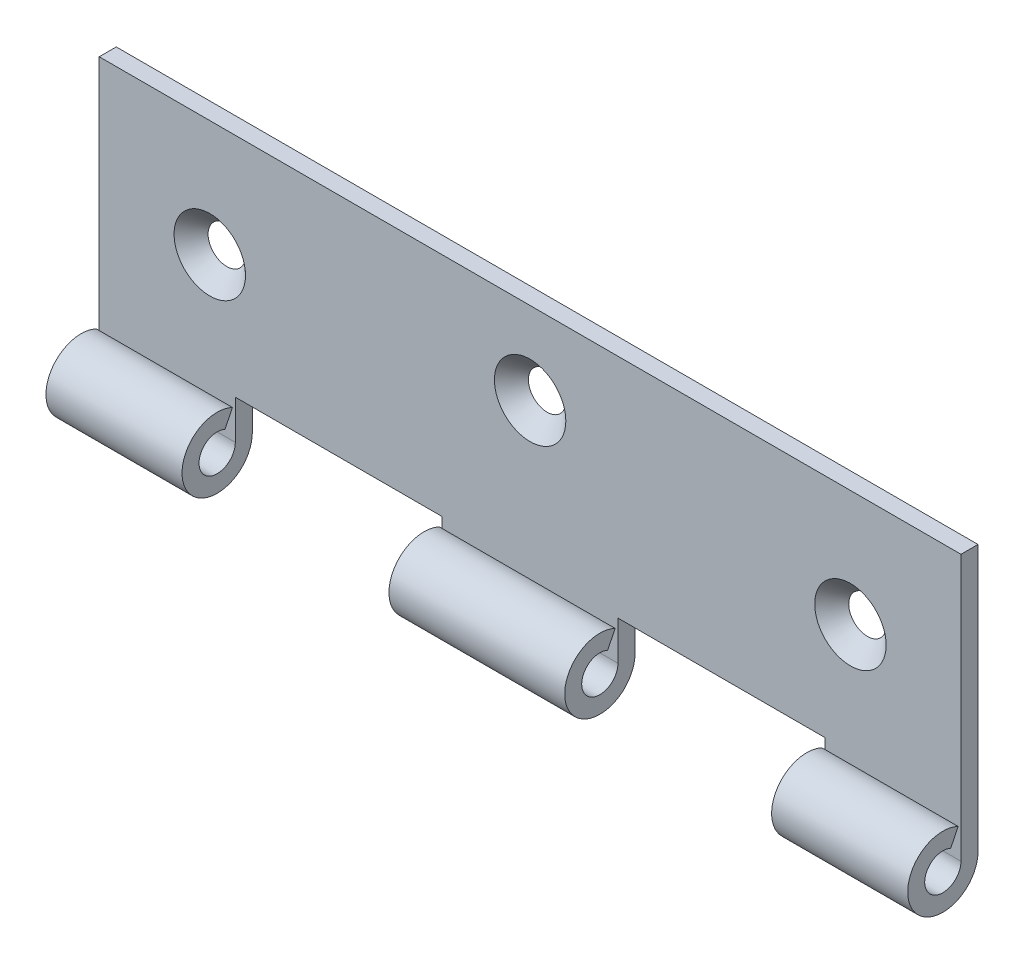
ISO-10303-21;
HEADER;
FILE_DESCRIPTION(('STEP AP214'),'2;1');
FILE_NAME('part.step','',(''),(''),'','','');
FILE_SCHEMA(('AUTOMOTIVE_DESIGN { 1 0 10303 214 1 1 1 1 }'));
ENDSEC;
DATA;
#1=APPLICATION_CONTEXT('core data for automotive mechanical design processes');
#2=APPLICATION_PROTOCOL_DEFINITION('international standard','automotive_design',2000,#1);
#3=PRODUCT_CONTEXT('',#1,'mechanical');
#4=PRODUCT('Part','Part','',(#3));
#5=PRODUCT_RELATED_PRODUCT_CATEGORY('part','',(#4));
#6=PRODUCT_DEFINITION_FORMATION('','',#4);
#7=PRODUCT_DEFINITION_CONTEXT('part definition',#1,'design');
#8=PRODUCT_DEFINITION('design','',#6,#7);
#9=PRODUCT_DEFINITION_SHAPE('','',#8);
#10=(LENGTH_UNIT() NAMED_UNIT(*) SI_UNIT(.MILLI.,.METRE.));
#11=(NAMED_UNIT(*) PLANE_ANGLE_UNIT() SI_UNIT($,.RADIAN.));
#12=(NAMED_UNIT(*) SI_UNIT($,.STERADIAN.) SOLID_ANGLE_UNIT());
#13=UNCERTAINTY_MEASURE_WITH_UNIT(LENGTH_MEASURE(1.E-05),#10,'distance_accuracy_value','');
#14=(GEOMETRIC_REPRESENTATION_CONTEXT(3) GLOBAL_UNCERTAINTY_ASSIGNED_CONTEXT((#13)) GLOBAL_UNIT_ASSIGNED_CONTEXT((#10,
#11,#12)) REPRESENTATION_CONTEXT('',''));
#15=CARTESIAN_POINT('',(0.,0.,0.));
#16=DIRECTION('',(0.,0.,1.));
#17=DIRECTION('',(1.,0.,0.));
#18=AXIS2_PLACEMENT_3D('',#15,#16,#17);
#19=CARTESIAN_POINT('',(-38.,-10.,1.5));
#20=DIRECTION('',(0.,1.,0.));
#21=DIRECTION('',(0.,0.,1.));
#22=AXIS2_PLACEMENT_3D('',#19,#20,#21);
#23=PLANE('',#22);
#24=DIRECTION('',(0.,0.,1.));
#25=VECTOR('',#24,1.);
#26=CARTESIAN_POINT('',(-26.,-10.,1.5));
#27=LINE('',#26,#25);
#28=CARTESIAN_POINT('',(-26.,-10.,0.));
#29=VERTEX_POINT('',#28);
#30=CARTESIAN_POINT('',(-26.,-10.,1.5));
#31=VERTEX_POINT('',#30);
#32=EDGE_CURVE('E206',#29,#31,#27,.T.);
#33=ORIENTED_EDGE('',*,*,#32,.F.);
#34=DIRECTION('',(1.,0.,0.));
#35=VECTOR('',#34,1.);
#36=CARTESIAN_POINT('',(-38.,-10.,0.));
#37=LINE('',#36,#35);
#38=CARTESIAN_POINT('',(-7.75,-10.,0.));
#39=VERTEX_POINT('',#38);
#40=EDGE_CURVE('E288',#29,#39,#37,.T.);
#41=ORIENTED_EDGE('',*,*,#40,.T.);
#42=DIRECTION('',(0.,0.,-1.));
#43=VECTOR('',#42,1.);
#44=CARTESIAN_POINT('',(-7.75,-10.,1.5));
#45=LINE('',#44,#43);
#46=CARTESIAN_POINT('',(-7.75,-10.,1.5));
#47=VERTEX_POINT('',#46);
#48=EDGE_CURVE('E287',#47,#39,#45,.T.);
#49=ORIENTED_EDGE('',*,*,#48,.F.);
#50=DIRECTION('',(1.,0.,0.));
#51=VECTOR('',#50,1.);
#52=CARTESIAN_POINT('',(-38.,-10.,1.5));
#53=LINE('',#52,#51);
#54=EDGE_CURVE('E68',#31,#47,#53,.T.);
#55=ORIENTED_EDGE('',*,*,#54,.F.);
#56=EDGE_LOOP('',(#33,#41,#49,#55));
#57=FACE_BOUND('',#56,.T.);
#58=ADVANCED_FACE('F51',(#57),#23,.F.);
#59=DIRECTION('',(0.,0.,-1.));
#60=VECTOR('',#59,1.);
#61=CARTESIAN_POINT('',(26.,-10.,1.5));
#62=LINE('',#61,#60);
#63=CARTESIAN_POINT('',(26.,-10.,1.5));
#64=VERTEX_POINT('',#63);
#65=CARTESIAN_POINT('',(26.,-10.,0.));
#66=VERTEX_POINT('',#65);
#67=EDGE_CURVE('E76',#64,#66,#62,.T.);
#68=ORIENTED_EDGE('',*,*,#67,.F.);
#69=CARTESIAN_POINT('',(7.75,-10.,1.5));
#70=VERTEX_POINT('',#69);
#71=EDGE_CURVE('E263',#70,#64,#53,.T.);
#72=ORIENTED_EDGE('',*,*,#71,.F.);
#73=DIRECTION('',(0.,0.,1.));
#74=VECTOR('',#73,1.);
#75=CARTESIAN_POINT('',(7.75,-10.,1.5));
#76=LINE('',#75,#74);
#77=CARTESIAN_POINT('',(7.75,-10.,0.));
#78=VERTEX_POINT('',#77);
#79=EDGE_CURVE('E292',#78,#70,#76,.T.);
#80=ORIENTED_EDGE('',*,*,#79,.F.);
#81=EDGE_CURVE('E188',#78,#66,#37,.T.);
#82=ORIENTED_EDGE('',*,*,#81,.T.);
#83=EDGE_LOOP('',(#68,#72,#80,#82));
#84=FACE_BOUND('',#83,.T.);
#85=ADVANCED_FACE('F347',(#84),#23,.F.);
#86=CARTESIAN_POINT('',(-38.,-10.,1.5));
#87=DIRECTION('',(1.,0.,0.));
#88=DIRECTION('',(0.,0.,-1.));
#89=AXIS2_PLACEMENT_3D('',#86,#87,#88);
#90=PLANE('',#89);
#91=DIRECTION('',(0.,-1.,0.));
#92=VECTOR('',#91,1.);
#93=CARTESIAN_POINT('',(-38.,-10.,0.));
#94=LINE('',#93,#92);
#95=CARTESIAN_POINT('',(-38.,10.,0.));
#96=VERTEX_POINT('',#95);
#97=CARTESIAN_POINT('',(-38.,-13.45,0.));
#98=VERTEX_POINT('',#97);
#99=EDGE_CURVE('E180',#96,#98,#94,.T.);
#100=ORIENTED_EDGE('',*,*,#99,.T.);
#101=CARTESIAN_POINT('',(-38.,-13.45,3.1));
#102=DIRECTION('',(-1.,0.,0.));
#103=DIRECTION('',(0.,0.,1.));
#104=AXIS2_PLACEMENT_3D('',#101,#102,#103);
#105=CIRCLE('',#104,3.1);
#106=CARTESIAN_POINT('',(-38.,-10.6556252476223,1.7578115842871));
#107=VERTEX_POINT('',#106);
#108=EDGE_CURVE('E182',#98,#107,#105,.T.);
#109=ORIENTED_EDGE('',*,*,#108,.T.);
#110=DIRECTION('',(0.,0.901411210444429,-0.432964005068678));
#111=VECTOR('',#110,1.);
#112=CARTESIAN_POINT('',(-38.,-12.0077420632889,2.40725759189011));
#113=LINE('',#112,#111);
#114=CARTESIAN_POINT('',(-38.,-12.0077420632889,2.40725759189011));
#115=VERTEX_POINT('',#114);
#116=EDGE_CURVE('E219',#115,#107,#113,.T.);
#117=ORIENTED_EDGE('',*,*,#116,.F.);
#118=CARTESIAN_POINT('',(-38.,-13.45,3.1));
#119=DIRECTION('',(-1.,0.,0.));
#120=DIRECTION('',(0.,0.,1.));
#121=AXIS2_PLACEMENT_3D('',#118,#119,#120);
#122=CIRCLE('',#121,1.6);
#123=CARTESIAN_POINT('',(-38.,-13.45,1.5));
#124=VERTEX_POINT('',#123);
#125=EDGE_CURVE('E267',#124,#115,#122,.T.);
#126=ORIENTED_EDGE('',*,*,#125,.F.);
#127=DIRECTION('',(0.,-1.,0.));
#128=VECTOR('',#127,1.);
#129=CARTESIAN_POINT('',(-38.,-10.,1.5));
#130=LINE('',#129,#128);
#131=CARTESIAN_POINT('',(-38.,10.,1.5));
#132=VERTEX_POINT('',#131);
#133=EDGE_CURVE('E259',#132,#124,#130,.T.);
#134=ORIENTED_EDGE('',*,*,#133,.F.);
#135=DIRECTION('',(0.,0.,-1.));
#136=VECTOR('',#135,1.);
#137=CARTESIAN_POINT('',(-38.,10.,1.5));
#138=LINE('',#137,#136);
#139=EDGE_CURVE('E60',#132,#96,#138,.T.);
#140=ORIENTED_EDGE('',*,*,#139,.T.);
#141=EDGE_LOOP('',(#100,#109,#117,#126,#134,#140));
#142=FACE_BOUND('',#141,.T.);
#143=ADVANCED_FACE('F53',(#142),#90,.F.);
#144=CARTESIAN_POINT('',(38.,-10.,1.5));
#145=DIRECTION('',(-1.,0.,0.));
#146=DIRECTION('',(0.,0.,1.));
#147=AXIS2_PLACEMENT_3D('',#144,#145,#146);
#148=PLANE('',#147);
#149=DIRECTION('',(0.,1.,0.));
#150=VECTOR('',#149,1.);
#151=CARTESIAN_POINT('',(38.,-10.,0.));
#152=LINE('',#151,#150);
#153=CARTESIAN_POINT('',(38.,-13.45,0.));
#154=VERTEX_POINT('',#153);
#155=CARTESIAN_POINT('',(38.,10.,0.));
#156=VERTEX_POINT('',#155);
#157=EDGE_CURVE('E313',#154,#156,#152,.T.);
#158=ORIENTED_EDGE('',*,*,#157,.T.);
#159=DIRECTION('',(0.,0.,-1.));
#160=VECTOR('',#159,1.);
#161=CARTESIAN_POINT('',(38.,10.,1.5));
#162=LINE('',#161,#160);
#163=CARTESIAN_POINT('',(38.,10.,1.5));
#164=VERTEX_POINT('',#163);
#165=EDGE_CURVE('E12',#164,#156,#162,.T.);
#166=ORIENTED_EDGE('',*,*,#165,.F.);
#167=DIRECTION('',(0.,1.,0.));
#168=VECTOR('',#167,1.);
#169=CARTESIAN_POINT('',(38.,-10.,1.5));
#170=LINE('',#169,#168);
#171=CARTESIAN_POINT('',(38.,-13.45,1.5));
#172=VERTEX_POINT('',#171);
#173=EDGE_CURVE('E284',#172,#164,#170,.T.);
#174=ORIENTED_EDGE('',*,*,#173,.F.);
#175=CARTESIAN_POINT('',(38.,-13.45,3.1));
#176=DIRECTION('',(-1.,0.,0.));
#177=DIRECTION('',(0.,0.,1.));
#178=AXIS2_PLACEMENT_3D('',#175,#176,#177);
#179=CIRCLE('',#178,1.6);
#180=CARTESIAN_POINT('',(38.,-12.0077420632889,2.40725759189011));
#181=VERTEX_POINT('',#180);
#182=EDGE_CURVE('E649',#172,#181,#179,.T.);
#183=ORIENTED_EDGE('',*,*,#182,.T.);
#184=DIRECTION('',(0.,-0.901411210444429,0.432964005068678));
#185=VECTOR('',#184,1.);
#186=CARTESIAN_POINT('',(38.,-12.0077420632889,2.40725759189011));
#187=LINE('',#186,#185);
#188=CARTESIAN_POINT('',(38.,-10.6556252476223,1.7578115842871));
#189=VERTEX_POINT('',#188);
#190=EDGE_CURVE('E640',#189,#181,#187,.T.);
#191=ORIENTED_EDGE('',*,*,#190,.F.);
#192=CARTESIAN_POINT('',(38.,-13.45,3.1));
#193=DIRECTION('',(-1.,0.,0.));
#194=DIRECTION('',(0.,0.,1.));
#195=AXIS2_PLACEMENT_3D('',#192,#193,#194);
#196=CIRCLE('',#195,3.1);
#197=EDGE_CURVE('E335',#154,#189,#196,.T.);
#198=ORIENTED_EDGE('',*,*,#197,.F.);
#199=EDGE_LOOP('',(#158,#166,#174,#183,#191,#198));
#200=FACE_BOUND('',#199,.T.);
#201=ADVANCED_FACE('F333',(#200),#148,.F.);
#202=CARTESIAN_POINT('',(-38.,10.,1.5));
#203=DIRECTION('',(0.,-1.,0.));
#204=DIRECTION('',(1.,0.,0.));
#205=AXIS2_PLACEMENT_3D('',#202,#203,#204);
#206=PLANE('',#205);
#207=DIRECTION('',(-1.,0.,0.));
#208=VECTOR('',#207,1.);
#209=CARTESIAN_POINT('',(-38.,10.,0.));
#210=LINE('',#209,#208);
#211=EDGE_CURVE('E264',#156,#96,#210,.T.);
#212=ORIENTED_EDGE('',*,*,#211,.T.);
#213=ORIENTED_EDGE('',*,*,#139,.F.);
#214=DIRECTION('',(-1.,0.,0.));
#215=VECTOR('',#214,1.);
#216=CARTESIAN_POINT('',(-38.,10.,1.5));
#217=LINE('',#216,#215);
#218=EDGE_CURVE('E262',#164,#132,#217,.T.);
#219=ORIENTED_EDGE('',*,*,#218,.F.);
#220=ORIENTED_EDGE('',*,*,#165,.T.);
#221=EDGE_LOOP('',(#212,#213,#219,#220));
#222=FACE_BOUND('',#221,.T.);
#223=ADVANCED_FACE('F254',(#222),#206,.F.);
#224=CARTESIAN_POINT('',(-38.,-10.,1.5));
#225=DIRECTION('',(0.,0.,-1.));
#226=DIRECTION('',(-1.,0.,0.));
#227=AXIS2_PLACEMENT_3D('',#224,#225,#226);
#228=PLANE('',#227);
#229=CARTESIAN_POINT('',(28.25,-0.250000000000004,1.5));
#230=DIRECTION('',(0.,0.,1.));
#231=DIRECTION('',(1.,0.,0.));
#232=AXIS2_PLACEMENT_3D('',#229,#230,#231);
#233=CIRCLE('',#232,3.15);
#234=CARTESIAN_POINT('',(31.4,-0.250000000000004,1.5));
#235=VERTEX_POINT('',#234);
#236=EDGE_CURVE('E243',#235,#235,#233,.T.);
#237=ORIENTED_EDGE('',*,*,#236,.F.);
#238=EDGE_LOOP('',(#237));
#239=FACE_BOUND('',#238,.T.);
#240=CARTESIAN_POINT('',(0.,2.75,1.5));
#241=DIRECTION('',(0.,0.,1.));
#242=DIRECTION('',(1.,0.,0.));
#243=AXIS2_PLACEMENT_3D('',#240,#241,#242);
#244=CIRCLE('',#243,3.15);
#245=CARTESIAN_POINT('',(3.15,2.75,1.5));
#246=VERTEX_POINT('',#245);
#247=EDGE_CURVE('E235',#246,#246,#244,.T.);
#248=ORIENTED_EDGE('',*,*,#247,.F.);
#249=EDGE_LOOP('',(#248));
#250=FACE_BOUND('',#249,.T.);
#251=CARTESIAN_POINT('',(-28.25,-0.250000000000004,1.5));
#252=DIRECTION('',(0.,0.,1.));
#253=DIRECTION('',(1.,0.,0.));
#254=AXIS2_PLACEMENT_3D('',#251,#252,#253);
#255=CIRCLE('',#254,3.15);
#256=CARTESIAN_POINT('',(-25.1,-0.250000000000004,1.5));
#257=VERTEX_POINT('',#256);
#258=EDGE_CURVE('E214',#257,#257,#255,.T.);
#259=ORIENTED_EDGE('',*,*,#258,.F.);
#260=EDGE_LOOP('',(#259));
#261=FACE_BOUND('',#260,.T.);
#262=ORIENTED_EDGE('',*,*,#133,.T.);
#263=DIRECTION('',(-1.,0.,0.));
#264=VECTOR('',#263,1.);
#265=CARTESIAN_POINT('',(-38.,-13.45,1.5));
#266=LINE('',#265,#264);
#267=CARTESIAN_POINT('',(-26.,-13.45,1.5));
#268=VERTEX_POINT('',#267);
#269=EDGE_CURVE('E205',#268,#124,#266,.T.);
#270=ORIENTED_EDGE('',*,*,#269,.F.);
#271=DIRECTION('',(0.,1.,0.));
#272=VECTOR('',#271,1.);
#273=CARTESIAN_POINT('',(-26.,-13.45,1.5));
#274=LINE('',#273,#272);
#275=EDGE_CURVE('E209',#268,#31,#274,.T.);
#276=ORIENTED_EDGE('',*,*,#275,.T.);
#277=ORIENTED_EDGE('',*,*,#54,.T.);
#278=DIRECTION('',(0.,1.,0.));
#279=VECTOR('',#278,1.);
#280=CARTESIAN_POINT('',(-7.75,-13.45,1.5));
#281=LINE('',#280,#279);
#282=CARTESIAN_POINT('',(-7.75,-13.45,1.5));
#283=VERTEX_POINT('',#282);
#284=EDGE_CURVE('E283',#283,#47,#281,.T.);
#285=ORIENTED_EDGE('',*,*,#284,.F.);
#286=DIRECTION('',(-1.,0.,0.));
#287=VECTOR('',#286,1.);
#288=CARTESIAN_POINT('',(-7.75,-13.45,1.5));
#289=LINE('',#288,#287);
#290=CARTESIAN_POINT('',(7.75,-13.45,1.5));
#291=VERTEX_POINT('',#290);
#292=EDGE_CURVE('E300',#291,#283,#289,.T.);
#293=ORIENTED_EDGE('',*,*,#292,.F.);
#294=DIRECTION('',(0.,1.,0.));
#295=VECTOR('',#294,1.);
#296=CARTESIAN_POINT('',(7.75,-13.45,1.5));
#297=LINE('',#296,#295);
#298=EDGE_CURVE('E299',#291,#70,#297,.T.);
#299=ORIENTED_EDGE('',*,*,#298,.T.);
#300=ORIENTED_EDGE('',*,*,#71,.T.);
#301=DIRECTION('',(0.,1.,0.));
#302=VECTOR('',#301,1.);
#303=CARTESIAN_POINT('',(26.,-13.45,1.5));
#304=LINE('',#303,#302);
#305=CARTESIAN_POINT('',(26.,-13.45,1.5));
#306=VERTEX_POINT('',#305);
#307=EDGE_CURVE('E627',#306,#64,#304,.T.);
#308=ORIENTED_EDGE('',*,*,#307,.F.);
#309=DIRECTION('',(-1.,0.,0.));
#310=VECTOR('',#309,1.);
#311=CARTESIAN_POINT('',(26.,-13.45,1.5));
#312=LINE('',#311,#310);
#313=EDGE_CURVE('E630',#172,#306,#312,.T.);
#314=ORIENTED_EDGE('',*,*,#313,.F.);
#315=ORIENTED_EDGE('',*,*,#173,.T.);
#316=ORIENTED_EDGE('',*,*,#218,.T.);
#317=EDGE_LOOP('',(#262,#270,#276,#277,#285,#293,#299,#300,#308,#314,#315,#316));
#318=FACE_BOUND('',#317,.T.);
#319=ADVANCED_FACE('F251',(#239,#250,#261,#318),#228,.F.);
#320=CARTESIAN_POINT('',(-38.,-10.,0.));
#321=DIRECTION('',(0.,0.,-1.));
#322=DIRECTION('',(-1.,0.,0.));
#323=AXIS2_PLACEMENT_3D('',#320,#321,#322);
#324=PLANE('',#323);
#325=CARTESIAN_POINT('',(28.25,-0.250000000000004,0.));
#326=DIRECTION('',(0.,0.,-1.));
#327=DIRECTION('',(-1.,0.,0.));
#328=AXIS2_PLACEMENT_3D('',#325,#326,#327);
#329=CIRCLE('',#328,1.65);
#330=CARTESIAN_POINT('',(26.6,-0.250000000000004,0.));
#331=VERTEX_POINT('',#330);
#332=EDGE_CURVE('E239',#331,#331,#329,.T.);
#333=ORIENTED_EDGE('',*,*,#332,.F.);
#334=EDGE_LOOP('',(#333));
#335=FACE_BOUND('',#334,.T.);
#336=CARTESIAN_POINT('',(0.,2.75,0.));
#337=DIRECTION('',(0.,0.,-1.));
#338=DIRECTION('',(-1.,0.,0.));
#339=AXIS2_PLACEMENT_3D('',#336,#337,#338);
#340=CIRCLE('',#339,1.65);
#341=CARTESIAN_POINT('',(-1.65,2.75,0.));
#342=VERTEX_POINT('',#341);
#343=EDGE_CURVE('E55',#342,#342,#340,.T.);
#344=ORIENTED_EDGE('',*,*,#343,.F.);
#345=EDGE_LOOP('',(#344));
#346=FACE_BOUND('',#345,.T.);
#347=CARTESIAN_POINT('',(-28.25,-0.250000000000004,0.));
#348=DIRECTION('',(0.,0.,-1.));
#349=DIRECTION('',(-1.,0.,0.));
#350=AXIS2_PLACEMENT_3D('',#347,#348,#349);
#351=CIRCLE('',#350,1.65);
#352=CARTESIAN_POINT('',(-29.9,-0.250000000000004,0.));
#353=VERTEX_POINT('',#352);
#354=EDGE_CURVE('E211',#353,#353,#351,.T.);
#355=ORIENTED_EDGE('',*,*,#354,.F.);
#356=EDGE_LOOP('',(#355));
#357=FACE_BOUND('',#356,.T.);
#358=ORIENTED_EDGE('',*,*,#99,.F.);
#359=ORIENTED_EDGE('',*,*,#211,.F.);
#360=ORIENTED_EDGE('',*,*,#157,.F.);
#361=DIRECTION('',(1.,0.,0.));
#362=VECTOR('',#361,1.);
#363=CARTESIAN_POINT('',(26.,-13.45,0.));
#364=LINE('',#363,#362);
#365=CARTESIAN_POINT('',(26.,-13.45,0.));
#366=VERTEX_POINT('',#365);
#367=EDGE_CURVE('E624',#366,#154,#364,.T.);
#368=ORIENTED_EDGE('',*,*,#367,.F.);
#369=DIRECTION('',(0.,1.,0.));
#370=VECTOR('',#369,1.);
#371=CARTESIAN_POINT('',(26.,-13.45,0.));
#372=LINE('',#371,#370);
#373=EDGE_CURVE('E623',#366,#66,#372,.T.);
#374=ORIENTED_EDGE('',*,*,#373,.T.);
#375=ORIENTED_EDGE('',*,*,#81,.F.);
#376=DIRECTION('',(0.,1.,0.));
#377=VECTOR('',#376,1.);
#378=CARTESIAN_POINT('',(7.75,-13.45,0.));
#379=LINE('',#378,#377);
#380=CARTESIAN_POINT('',(7.75,-13.45,0.));
#381=VERTEX_POINT('',#380);
#382=EDGE_CURVE('E303',#381,#78,#379,.T.);
#383=ORIENTED_EDGE('',*,*,#382,.F.);
#384=DIRECTION('',(1.,0.,0.));
#385=VECTOR('',#384,1.);
#386=CARTESIAN_POINT('',(-7.75,-13.45,0.));
#387=LINE('',#386,#385);
#388=CARTESIAN_POINT('',(-7.75,-13.45,0.));
#389=VERTEX_POINT('',#388);
#390=EDGE_CURVE('E305',#389,#381,#387,.T.);
#391=ORIENTED_EDGE('',*,*,#390,.F.);
#392=DIRECTION('',(0.,1.,0.));
#393=VECTOR('',#392,1.);
#394=CARTESIAN_POINT('',(-7.75,-13.45,0.));
#395=LINE('',#394,#393);
#396=EDGE_CURVE('E593',#389,#39,#395,.T.);
#397=ORIENTED_EDGE('',*,*,#396,.T.);
#398=ORIENTED_EDGE('',*,*,#40,.F.);
#399=DIRECTION('',(0.,1.,0.));
#400=VECTOR('',#399,1.);
#401=CARTESIAN_POINT('',(-26.,-13.45,0.));
#402=LINE('',#401,#400);
#403=CARTESIAN_POINT('',(-26.,-13.45,0.));
#404=VERTEX_POINT('',#403);
#405=EDGE_CURVE('E204',#404,#29,#402,.T.);
#406=ORIENTED_EDGE('',*,*,#405,.F.);
#407=DIRECTION('',(1.,0.,0.));
#408=VECTOR('',#407,1.);
#409=CARTESIAN_POINT('',(-38.,-13.45,0.));
#410=LINE('',#409,#408);
#411=EDGE_CURVE('E195',#98,#404,#410,.T.);
#412=ORIENTED_EDGE('',*,*,#411,.F.);
#413=EDGE_LOOP('',(#358,#359,#360,#368,#374,#375,#383,#391,#397,#398,#406,#412));
#414=FACE_BOUND('',#413,.T.);
#415=ADVANCED_FACE('F202',(#335,#346,#357,#414),#324,.T.);
#416=CARTESIAN_POINT('',(0.,-13.45,3.1));
#417=DIRECTION('',(-1.,0.,0.));
#418=DIRECTION('',(0.,0.,1.));
#419=AXIS2_PLACEMENT_3D('',#416,#417,#418);
#420=CYLINDRICAL_SURFACE('',#419,3.1);
#421=ORIENTED_EDGE('',*,*,#390,.T.);
#422=CARTESIAN_POINT('',(7.75,-13.45,3.1));
#423=DIRECTION('',(-1.,0.,0.));
#424=DIRECTION('',(0.,0.,1.));
#425=AXIS2_PLACEMENT_3D('',#422,#423,#424);
#426=CIRCLE('',#425,3.1);
#427=CARTESIAN_POINT('',(7.75,-10.6556252476223,1.7578115842871));
#428=VERTEX_POINT('',#427);
#429=EDGE_CURVE('E586',#381,#428,#426,.T.);
#430=ORIENTED_EDGE('',*,*,#429,.T.);
#431=DIRECTION('',(1.,0.,0.));
#432=VECTOR('',#431,1.);
#433=CARTESIAN_POINT('',(-7.75,-10.6556252476223,1.7578115842871));
#434=LINE('',#433,#432);
#435=CARTESIAN_POINT('',(-7.75,-10.6556252476223,1.7578115842871));
#436=VERTEX_POINT('',#435);
#437=EDGE_CURVE('E613',#436,#428,#434,.T.);
#438=ORIENTED_EDGE('',*,*,#437,.F.);
#439=CARTESIAN_POINT('',(-7.75,-13.45,3.1));
#440=DIRECTION('',(-1.,0.,0.));
#441=DIRECTION('',(0.,0.,1.));
#442=AXIS2_PLACEMENT_3D('',#439,#440,#441);
#443=CIRCLE('',#442,3.1);
#444=EDGE_CURVE('E189',#389,#436,#443,.T.);
#445=ORIENTED_EDGE('',*,*,#444,.F.);
#446=EDGE_LOOP('',(#421,#430,#438,#445));
#447=FACE_BOUND('',#446,.T.);
#448=ADVANCED_FACE('F403',(#447),#420,.T.);
#449=CARTESIAN_POINT('',(0.,-13.45,3.1));
#450=DIRECTION('',(-1.,0.,0.));
#451=DIRECTION('',(0.,0.,1.));
#452=AXIS2_PLACEMENT_3D('',#449,#450,#451);
#453=CYLINDRICAL_SURFACE('',#452,1.6);
#454=ORIENTED_EDGE('',*,*,#292,.T.);
#455=CARTESIAN_POINT('',(-7.75,-13.45,3.1));
#456=DIRECTION('',(-1.,0.,0.));
#457=DIRECTION('',(0.,0.,1.));
#458=AXIS2_PLACEMENT_3D('',#455,#456,#457);
#459=CIRCLE('',#458,1.6);
#460=CARTESIAN_POINT('',(-7.75,-12.0077420632889,2.40725759189011));
#461=VERTEX_POINT('',#460);
#462=EDGE_CURVE('E297',#283,#461,#459,.T.);
#463=ORIENTED_EDGE('',*,*,#462,.T.);
#464=DIRECTION('',(-1.,0.,0.));
#465=VECTOR('',#464,1.);
#466=CARTESIAN_POINT('',(-7.75,-12.0077420632889,2.40725759189011));
#467=LINE('',#466,#465);
#468=CARTESIAN_POINT('',(7.75,-12.0077420632889,2.40725759189011));
#469=VERTEX_POINT('',#468);
#470=EDGE_CURVE('E603',#469,#461,#467,.T.);
#471=ORIENTED_EDGE('',*,*,#470,.F.);
#472=CARTESIAN_POINT('',(7.75,-13.45,3.1));
#473=DIRECTION('',(-1.,0.,0.));
#474=DIRECTION('',(0.,0.,1.));
#475=AXIS2_PLACEMENT_3D('',#472,#473,#474);
#476=CIRCLE('',#475,1.6);
#477=EDGE_CURVE('E616',#291,#469,#476,.T.);
#478=ORIENTED_EDGE('',*,*,#477,.F.);
#479=EDGE_LOOP('',(#454,#463,#471,#478));
#480=FACE_BOUND('',#479,.T.);
#481=ADVANCED_FACE('F507',(#480),#453,.F.);
#482=CARTESIAN_POINT('',(-7.75,-13.45,1.5));
#483=DIRECTION('',(1.,0.,0.));
#484=DIRECTION('',(0.,0.,-1.));
#485=AXIS2_PLACEMENT_3D('',#482,#483,#484);
#486=PLANE('',#485);
#487=ORIENTED_EDGE('',*,*,#48,.T.);
#488=ORIENTED_EDGE('',*,*,#396,.F.);
#489=ORIENTED_EDGE('',*,*,#444,.T.);
#490=DIRECTION('',(0.,0.901411210444429,-0.432964005068678));
#491=VECTOR('',#490,1.);
#492=CARTESIAN_POINT('',(-7.75,-12.0077420632889,2.40725759189011));
#493=LINE('',#492,#491);
#494=EDGE_CURVE('E595',#461,#436,#493,.T.);
#495=ORIENTED_EDGE('',*,*,#494,.F.);
#496=ORIENTED_EDGE('',*,*,#462,.F.);
#497=ORIENTED_EDGE('',*,*,#284,.T.);
#498=EDGE_LOOP('',(#487,#488,#489,#495,#496,#497));
#499=FACE_BOUND('',#498,.T.);
#500=ADVANCED_FACE('F295',(#499),#486,.F.);
#501=CARTESIAN_POINT('',(7.75,-13.45,1.5));
#502=DIRECTION('',(-1.,0.,0.));
#503=DIRECTION('',(0.,0.,1.));
#504=AXIS2_PLACEMENT_3D('',#501,#502,#503);
#505=PLANE('',#504);
#506=ORIENTED_EDGE('',*,*,#79,.T.);
#507=ORIENTED_EDGE('',*,*,#298,.F.);
#508=ORIENTED_EDGE('',*,*,#477,.T.);
#509=DIRECTION('',(0.,-0.901411210444429,0.432964005068678));
#510=VECTOR('',#509,1.);
#511=CARTESIAN_POINT('',(7.75,-12.0077420632889,2.40725759189011));
#512=LINE('',#511,#510);
#513=EDGE_CURVE('E607',#428,#469,#512,.T.);
#514=ORIENTED_EDGE('',*,*,#513,.F.);
#515=ORIENTED_EDGE('',*,*,#429,.F.);
#516=ORIENTED_EDGE('',*,*,#382,.T.);
#517=EDGE_LOOP('',(#506,#507,#508,#514,#515,#516));
#518=FACE_BOUND('',#517,.T.);
#519=ADVANCED_FACE('F488',(#518),#505,.F.);
#520=CARTESIAN_POINT('',(-7.75,-10.6556252476223,1.7578115842871));
#521=DIRECTION('',(0.,-0.432964005068678,-0.901411210444429));
#522=DIRECTION('',(0.,0.901411210444429,-0.432964005068678));
#523=AXIS2_PLACEMENT_3D('',#520,#521,#522);
#524=PLANE('',#523);
#525=ORIENTED_EDGE('',*,*,#494,.T.);
#526=ORIENTED_EDGE('',*,*,#437,.T.);
#527=ORIENTED_EDGE('',*,*,#513,.T.);
#528=ORIENTED_EDGE('',*,*,#470,.T.);
#529=EDGE_LOOP('',(#525,#526,#527,#528));
#530=FACE_BOUND('',#529,.T.);
#531=ADVANCED_FACE('F475',(#530),#524,.T.);
#532=CARTESIAN_POINT('',(32.,-13.45,3.1));
#533=DIRECTION('',(-1.,0.,0.));
#534=DIRECTION('',(0.,0.,1.));
#535=AXIS2_PLACEMENT_3D('',#532,#533,#534);
#536=CYLINDRICAL_SURFACE('',#535,3.1);
#537=ORIENTED_EDGE('',*,*,#367,.T.);
#538=ORIENTED_EDGE('',*,*,#197,.T.);
#539=DIRECTION('',(1.,0.,0.));
#540=VECTOR('',#539,1.);
#541=CARTESIAN_POINT('',(26.,-10.6556252476223,1.7578115842871));
#542=LINE('',#541,#540);
#543=CARTESIAN_POINT('',(26.,-10.6556252476223,1.7578115842871));
#544=VERTEX_POINT('',#543);
#545=EDGE_CURVE('E643',#544,#189,#542,.T.);
#546=ORIENTED_EDGE('',*,*,#545,.F.);
#547=CARTESIAN_POINT('',(26.,-13.45,3.1));
#548=DIRECTION('',(-1.,0.,0.));
#549=DIRECTION('',(0.,0.,1.));
#550=AXIS2_PLACEMENT_3D('',#547,#548,#549);
#551=CIRCLE('',#550,3.1);
#552=EDGE_CURVE('E293',#366,#544,#551,.T.);
#553=ORIENTED_EDGE('',*,*,#552,.F.);
#554=EDGE_LOOP('',(#537,#538,#546,#553));
#555=FACE_BOUND('',#554,.T.);
#556=ADVANCED_FACE('F466',(#555),#536,.T.);
#557=CARTESIAN_POINT('',(32.,-13.45,3.1));
#558=DIRECTION('',(-1.,0.,0.));
#559=DIRECTION('',(0.,0.,1.));
#560=AXIS2_PLACEMENT_3D('',#557,#558,#559);
#561=CYLINDRICAL_SURFACE('',#560,1.6);
#562=ORIENTED_EDGE('',*,*,#313,.T.);
#563=CARTESIAN_POINT('',(26.,-13.45,3.1));
#564=DIRECTION('',(-1.,0.,0.));
#565=DIRECTION('',(0.,0.,1.));
#566=AXIS2_PLACEMENT_3D('',#563,#564,#565);
#567=CIRCLE('',#566,1.6);
#568=CARTESIAN_POINT('',(26.,-12.0077420632889,2.40725759189011));
#569=VERTEX_POINT('',#568);
#570=EDGE_CURVE('E646',#306,#569,#567,.T.);
#571=ORIENTED_EDGE('',*,*,#570,.T.);
#572=DIRECTION('',(-1.,0.,0.));
#573=VECTOR('',#572,1.);
#574=CARTESIAN_POINT('',(26.,-12.0077420632889,2.40725759189011));
#575=LINE('',#574,#573);
#576=EDGE_CURVE('E637',#181,#569,#575,.T.);
#577=ORIENTED_EDGE('',*,*,#576,.F.);
#578=ORIENTED_EDGE('',*,*,#182,.F.);
#579=EDGE_LOOP('',(#562,#571,#577,#578));
#580=FACE_BOUND('',#579,.T.);
#581=ADVANCED_FACE('F457',(#580),#561,.F.);
#582=CARTESIAN_POINT('',(26.,-13.45,1.5));
#583=DIRECTION('',(1.,0.,0.));
#584=DIRECTION('',(0.,0.,-1.));
#585=AXIS2_PLACEMENT_3D('',#582,#583,#584);
#586=PLANE('',#585);
#587=ORIENTED_EDGE('',*,*,#67,.T.);
#588=ORIENTED_EDGE('',*,*,#373,.F.);
#589=ORIENTED_EDGE('',*,*,#552,.T.);
#590=DIRECTION('',(0.,0.901411210444429,-0.432964005068678));
#591=VECTOR('',#590,1.);
#592=CARTESIAN_POINT('',(26.,-12.0077420632889,2.40725759189011));
#593=LINE('',#592,#591);
#594=EDGE_CURVE('E626',#569,#544,#593,.T.);
#595=ORIENTED_EDGE('',*,*,#594,.F.);
#596=ORIENTED_EDGE('',*,*,#570,.F.);
#597=ORIENTED_EDGE('',*,*,#307,.T.);
#598=EDGE_LOOP('',(#587,#588,#589,#595,#596,#597));
#599=FACE_BOUND('',#598,.T.);
#600=ADVANCED_FACE('F447',(#599),#586,.F.);
#601=CARTESIAN_POINT('',(26.,-10.6556252476223,1.7578115842871));
#602=DIRECTION('',(0.,-0.432964005068678,-0.901411210444429));
#603=DIRECTION('',(0.,0.901411210444429,-0.432964005068678));
#604=AXIS2_PLACEMENT_3D('',#601,#602,#603);
#605=PLANE('',#604);
#606=ORIENTED_EDGE('',*,*,#594,.T.);
#607=ORIENTED_EDGE('',*,*,#545,.T.);
#608=ORIENTED_EDGE('',*,*,#190,.T.);
#609=ORIENTED_EDGE('',*,*,#576,.T.);
#610=EDGE_LOOP('',(#606,#607,#608,#609));
#611=FACE_BOUND('',#610,.T.);
#612=ADVANCED_FACE('F366',(#611),#605,.T.);
#613=CARTESIAN_POINT('',(-32.,-13.45,3.1));
#614=DIRECTION('',(-1.,0.,0.));
#615=DIRECTION('',(0.,0.,1.));
#616=AXIS2_PLACEMENT_3D('',#613,#614,#615);
#617=CYLINDRICAL_SURFACE('',#616,3.1);
#618=ORIENTED_EDGE('',*,*,#411,.T.);
#619=CARTESIAN_POINT('',(-26.,-13.45,3.1));
#620=DIRECTION('',(-1.,0.,0.));
#621=DIRECTION('',(0.,0.,1.));
#622=AXIS2_PLACEMENT_3D('',#619,#620,#621);
#623=CIRCLE('',#622,3.1);
#624=CARTESIAN_POINT('',(-26.,-10.6556252476223,1.7578115842871));
#625=VERTEX_POINT('',#624);
#626=EDGE_CURVE('E200',#404,#625,#623,.T.);
#627=ORIENTED_EDGE('',*,*,#626,.T.);
#628=DIRECTION('',(1.,0.,0.));
#629=VECTOR('',#628,1.);
#630=CARTESIAN_POINT('',(-38.,-10.6556252476223,1.7578115842871));
#631=LINE('',#630,#629);
#632=EDGE_CURVE('E198',#107,#625,#631,.T.);
#633=ORIENTED_EDGE('',*,*,#632,.F.);
#634=ORIENTED_EDGE('',*,*,#108,.F.);
#635=EDGE_LOOP('',(#618,#627,#633,#634));
#636=FACE_BOUND('',#635,.T.);
#637=ADVANCED_FACE('F193',(#636),#617,.T.);
#638=CARTESIAN_POINT('',(-32.,-13.45,3.1));
#639=DIRECTION('',(-1.,0.,0.));
#640=DIRECTION('',(0.,0.,1.));
#641=AXIS2_PLACEMENT_3D('',#638,#639,#640);
#642=CYLINDRICAL_SURFACE('',#641,1.6);
#643=ORIENTED_EDGE('',*,*,#269,.T.);
#644=ORIENTED_EDGE('',*,*,#125,.T.);
#645=DIRECTION('',(-1.,0.,0.));
#646=VECTOR('',#645,1.);
#647=CARTESIAN_POINT('',(-38.,-12.0077420632889,2.40725759189011));
#648=LINE('',#647,#646);
#649=CARTESIAN_POINT('',(-26.,-12.0077420632889,2.40725759189011));
#650=VERTEX_POINT('',#649);
#651=EDGE_CURVE('E275',#650,#115,#648,.T.);
#652=ORIENTED_EDGE('',*,*,#651,.F.);
#653=CARTESIAN_POINT('',(-26.,-13.45,3.1));
#654=DIRECTION('',(-1.,0.,0.));
#655=DIRECTION('',(0.,0.,1.));
#656=AXIS2_PLACEMENT_3D('',#653,#654,#655);
#657=CIRCLE('',#656,1.6);
#658=EDGE_CURVE('E270',#268,#650,#657,.T.);
#659=ORIENTED_EDGE('',*,*,#658,.F.);
#660=EDGE_LOOP('',(#643,#644,#652,#659));
#661=FACE_BOUND('',#660,.T.);
#662=ADVANCED_FACE('F272',(#661),#642,.F.);
#663=CARTESIAN_POINT('',(-26.,-13.45,1.5));
#664=DIRECTION('',(-1.,0.,0.));
#665=DIRECTION('',(0.,0.,1.));
#666=AXIS2_PLACEMENT_3D('',#663,#664,#665);
#667=PLANE('',#666);
#668=ORIENTED_EDGE('',*,*,#32,.T.);
#669=ORIENTED_EDGE('',*,*,#275,.F.);
#670=ORIENTED_EDGE('',*,*,#658,.T.);
#671=DIRECTION('',(0.,-0.901411210444429,0.432964005068678));
#672=VECTOR('',#671,1.);
#673=CARTESIAN_POINT('',(-26.,-12.0077420632889,2.40725759189011));
#674=LINE('',#673,#672);
#675=EDGE_CURVE('E660',#625,#650,#674,.T.);
#676=ORIENTED_EDGE('',*,*,#675,.F.);
#677=ORIENTED_EDGE('',*,*,#626,.F.);
#678=ORIENTED_EDGE('',*,*,#405,.T.);
#679=EDGE_LOOP('',(#668,#669,#670,#676,#677,#678));
#680=FACE_BOUND('',#679,.T.);
#681=ADVANCED_FACE('F279',(#680),#667,.F.);
#682=CARTESIAN_POINT('',(-38.,-10.6556252476223,1.7578115842871));
#683=DIRECTION('',(0.,-0.432964005068678,-0.901411210444429));
#684=DIRECTION('',(0.,0.901411210444429,-0.432964005068678));
#685=AXIS2_PLACEMENT_3D('',#682,#683,#684);
#686=PLANE('',#685);
#687=ORIENTED_EDGE('',*,*,#116,.T.);
#688=ORIENTED_EDGE('',*,*,#632,.T.);
#689=ORIENTED_EDGE('',*,*,#675,.T.);
#690=ORIENTED_EDGE('',*,*,#651,.T.);
#691=EDGE_LOOP('',(#687,#688,#689,#690));
#692=FACE_BOUND('',#691,.T.);
#693=ADVANCED_FACE('F383',(#692),#686,.T.);
#694=CARTESIAN_POINT('',(-28.25,-0.250000000000004,1.5));
#695=DIRECTION('',(0.,0.,1.));
#696=DIRECTION('',(1.,0.,0.));
#697=AXIS2_PLACEMENT_3D('',#694,#695,#696);
#698=CONICAL_SURFACE('',#697,3.15,0.785398163397448);
#699=ORIENTED_EDGE('',*,*,#354,.T.);
#700=EDGE_LOOP('',(#699));
#701=FACE_BOUND('',#700,.T.);
#702=ORIENTED_EDGE('',*,*,#258,.T.);
#703=EDGE_LOOP('',(#702));
#704=FACE_BOUND('',#703,.T.);
#705=ADVANCED_FACE('F389',(#701,#704),#698,.F.);
#706=CARTESIAN_POINT('',(0.,2.75,1.5));
#707=DIRECTION('',(0.,0.,1.));
#708=DIRECTION('',(1.,0.,0.));
#709=AXIS2_PLACEMENT_3D('',#706,#707,#708);
#710=CONICAL_SURFACE('',#709,3.15,0.785398163397448);
#711=ORIENTED_EDGE('',*,*,#343,.T.);
#712=EDGE_LOOP('',(#711));
#713=FACE_BOUND('',#712,.T.);
#714=ORIENTED_EDGE('',*,*,#247,.T.);
#715=EDGE_LOOP('',(#714));
#716=FACE_BOUND('',#715,.T.);
#717=ADVANCED_FACE('F410',(#713,#716),#710,.F.);
#718=CARTESIAN_POINT('',(28.25,-0.250000000000004,1.5));
#719=DIRECTION('',(0.,0.,1.));
#720=DIRECTION('',(1.,0.,0.));
#721=AXIS2_PLACEMENT_3D('',#718,#719,#720);
#722=CONICAL_SURFACE('',#721,3.15,0.785398163397448);
#723=ORIENTED_EDGE('',*,*,#332,.T.);
#724=EDGE_LOOP('',(#723));
#725=FACE_BOUND('',#724,.T.);
#726=ORIENTED_EDGE('',*,*,#236,.T.);
#727=EDGE_LOOP('',(#726));
#728=FACE_BOUND('',#727,.T.);
#729=ADVANCED_FACE('F249',(#725,#728),#722,.F.);
#730=CLOSED_SHELL('',(#58,#85,#143,#201,#223,#319,#415,#448,#481,#500,#519,#531,#556,#581,#600,
#612,#637,#662,#681,#693,#705,#717,#729));
#731=MANIFOLD_SOLID_BREP('B2',#730);
#732=ADVANCED_BREP_SHAPE_REPRESENTATION('',(#18,#731),#14);
#733=SHAPE_DEFINITION_REPRESENTATION(#9,#732);
ENDSEC;
END-ISO-10303-21;
